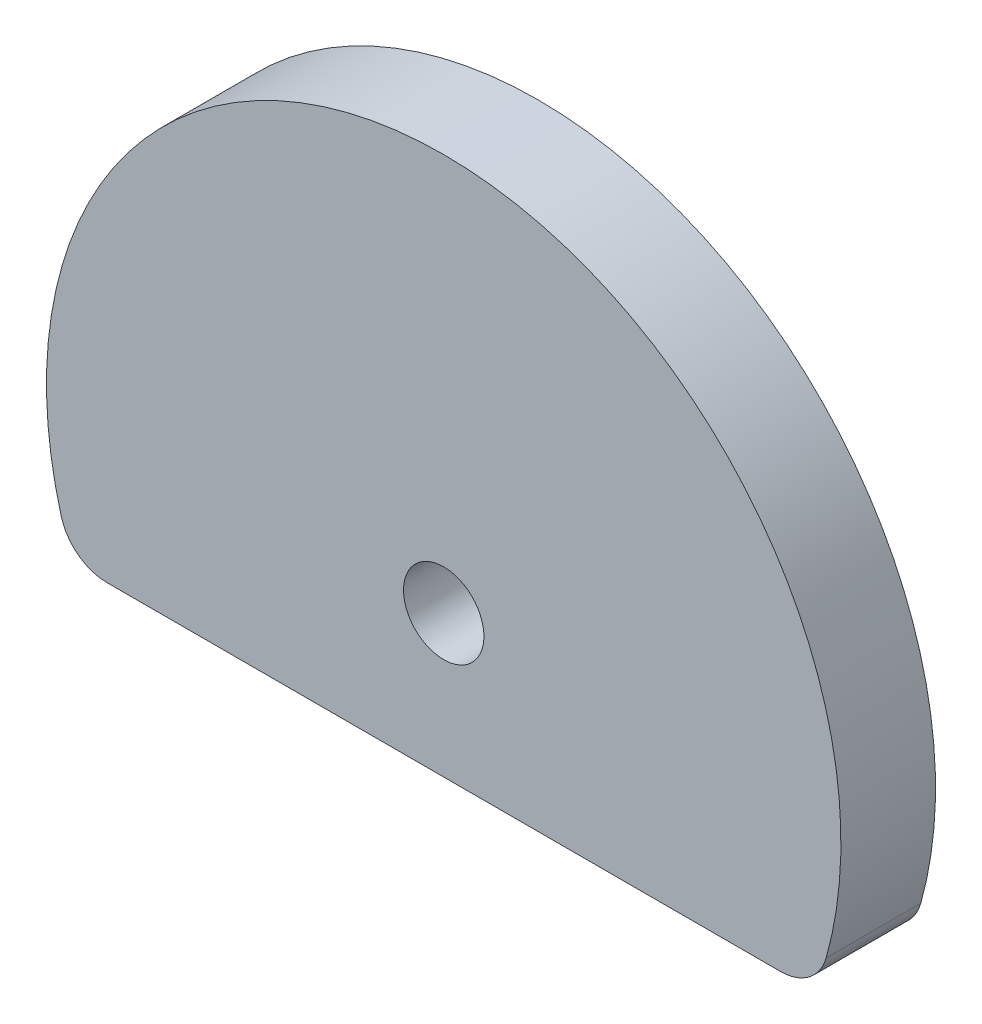
ISO-10303-21;
HEADER;
FILE_DESCRIPTION(('STEP AP214'),'2;1');
FILE_NAME('part.step','',(''),(''),'','','');
FILE_SCHEMA(('AUTOMOTIVE_DESIGN { 1 0 10303 214 1 1 1 1 }'));
ENDSEC;
DATA;
#1=APPLICATION_CONTEXT('core data for automotive mechanical design processes');
#2=APPLICATION_PROTOCOL_DEFINITION('international standard','automotive_design',2000,#1);
#3=PRODUCT_CONTEXT('',#1,'mechanical');
#4=PRODUCT('Part','Part','',(#3));
#5=PRODUCT_RELATED_PRODUCT_CATEGORY('part','',(#4));
#6=PRODUCT_DEFINITION_FORMATION('','',#4);
#7=PRODUCT_DEFINITION_CONTEXT('part definition',#1,'design');
#8=PRODUCT_DEFINITION('design','',#6,#7);
#9=PRODUCT_DEFINITION_SHAPE('','',#8);
#10=(LENGTH_UNIT() NAMED_UNIT(*) SI_UNIT(.MILLI.,.METRE.));
#11=(NAMED_UNIT(*) PLANE_ANGLE_UNIT() SI_UNIT($,.RADIAN.));
#12=(NAMED_UNIT(*) SI_UNIT($,.STERADIAN.) SOLID_ANGLE_UNIT());
#13=UNCERTAINTY_MEASURE_WITH_UNIT(LENGTH_MEASURE(1.E-05),#10,'distance_accuracy_value','');
#14=(GEOMETRIC_REPRESENTATION_CONTEXT(3) GLOBAL_UNCERTAINTY_ASSIGNED_CONTEXT((#13)) GLOBAL_UNIT_ASSIGNED_CONTEXT((#10,
#11,#12)) REPRESENTATION_CONTEXT('',''));
#15=CARTESIAN_POINT('',(0.,0.,0.));
#16=DIRECTION('',(0.,0.,1.));
#17=DIRECTION('',(1.,0.,0.));
#18=AXIS2_PLACEMENT_3D('',#15,#16,#17);
#19=CARTESIAN_POINT('',(0.,0.,0.));
#20=DIRECTION('',(0.,0.,1.));
#21=DIRECTION('',(0.,1.,0.));
#22=AXIS2_PLACEMENT_3D('',#19,#20,#21);
#23=CYLINDRICAL_SURFACE('',#22,8.4);
#24=DIRECTION('',(0.,0.,-1.));
#25=VECTOR('',#24,1.);
#26=CARTESIAN_POINT('',(8.087389745766,-2.27027027027,2.));
#27=LINE('',#26,#25);
#28=CARTESIAN_POINT('',(8.087389745766,-2.27027027027,2.));
#29=VERTEX_POINT('',#28);
#30=CARTESIAN_POINT('',(8.087389745766,-2.27027027027,0.));
#31=VERTEX_POINT('',#30);
#32=EDGE_CURVE('E61',#29,#31,#27,.T.);
#33=ORIENTED_EDGE('',*,*,#32,.T.);
#34=CARTESIAN_POINT('',(0.,0.,0.));
#35=DIRECTION('',(0.,0.,1.));
#36=DIRECTION('',(0.962784493543606,-0.270270270270302,0.));
#37=AXIS2_PLACEMENT_3D('',#34,#35,#36);
#38=CIRCLE('',#37,8.4);
#39=CARTESIAN_POINT('',(-8.087389745766,-2.27027027027,0.));
#40=VERTEX_POINT('',#39);
#41=EDGE_CURVE('E64',#31,#40,#38,.T.);
#42=ORIENTED_EDGE('',*,*,#41,.T.);
#43=DIRECTION('',(0.,0.,-1.));
#44=VECTOR('',#43,1.);
#45=CARTESIAN_POINT('',(-8.087389745766,-2.27027027027,2.));
#46=LINE('',#45,#44);
#47=CARTESIAN_POINT('',(-8.087389745766,-2.27027027027,2.));
#48=VERTEX_POINT('',#47);
#49=EDGE_CURVE('E11',#48,#40,#46,.T.);
#50=ORIENTED_EDGE('',*,*,#49,.F.);
#51=CARTESIAN_POINT('',(0.,0.,2.));
#52=DIRECTION('',(0.,0.,1.));
#53=DIRECTION('',(0.962784493543606,-0.270270270270302,0.));
#54=AXIS2_PLACEMENT_3D('',#51,#52,#53);
#55=CIRCLE('',#54,8.4);
#56=EDGE_CURVE('E67',#29,#48,#55,.T.);
#57=ORIENTED_EDGE('',*,*,#56,.F.);
#58=EDGE_LOOP('',(#33,#42,#50,#57));
#59=FACE_BOUND('',#58,.T.);
#60=ADVANCED_FACE('F17',(#59),#23,.T.);
#61=CARTESIAN_POINT('',(-7.124605252223,-2.,4.6072));
#62=DIRECTION('',(0.,0.,-1.));
#63=DIRECTION('',(0.,-1.,0.));
#64=AXIS2_PLACEMENT_3D('',#61,#62,#63);
#65=CYLINDRICAL_SURFACE('',#64,1.);
#66=CARTESIAN_POINT('',(-7.124605252223,-2.,0.));
#67=DIRECTION('',(0.,0.,-1.));
#68=DIRECTION('',(0.,-1.,0.));
#69=AXIS2_PLACEMENT_3D('',#66,#67,#68);
#70=CIRCLE('',#69,1.);
#71=CARTESIAN_POINT('',(-7.124605252223,-3.,0.));
#72=VERTEX_POINT('',#71);
#73=EDGE_CURVE('E81',#72,#40,#70,.T.);
#74=ORIENTED_EDGE('',*,*,#73,.F.);
#75=DIRECTION('',(0.,0.,-1.));
#76=VECTOR('',#75,1.);
#77=CARTESIAN_POINT('',(-7.124605252223,-3.,2.));
#78=LINE('',#77,#76);
#79=CARTESIAN_POINT('',(-7.124605252223,-3.,2.));
#80=VERTEX_POINT('',#79);
#81=EDGE_CURVE('E28',#80,#72,#78,.T.);
#82=ORIENTED_EDGE('',*,*,#81,.F.);
#83=CARTESIAN_POINT('',(-7.124605252223,-2.,2.));
#84=DIRECTION('',(0.,0.,1.));
#85=DIRECTION('',(-0.962784493543606,-0.270270270270302,0.));
#86=AXIS2_PLACEMENT_3D('',#83,#84,#85);
#87=CIRCLE('',#86,1.);
#88=EDGE_CURVE('E103',#48,#80,#87,.T.);
#89=ORIENTED_EDGE('',*,*,#88,.F.);
#90=ORIENTED_EDGE('',*,*,#49,.T.);
#91=EDGE_LOOP('',(#74,#82,#89,#90));
#92=FACE_BOUND('',#91,.T.);
#93=ADVANCED_FACE('F161',(#92),#65,.T.);
#94=CARTESIAN_POINT('',(-7.846018098373,-3.,0.));
#95=DIRECTION('',(0.,-1.,0.));
#96=DIRECTION('',(0.,0.,-1.));
#97=AXIS2_PLACEMENT_3D('',#94,#95,#96);
#98=PLANE('',#97);
#99=DIRECTION('',(0.,0.,-1.));
#100=VECTOR('',#99,1.);
#101=CARTESIAN_POINT('',(7.124605252223,-3.,2.));
#102=LINE('',#101,#100);
#103=CARTESIAN_POINT('',(7.124605252223,-3.,2.));
#104=VERTEX_POINT('',#103);
#105=CARTESIAN_POINT('',(7.124605252223,-3.,0.));
#106=VERTEX_POINT('',#105);
#107=EDGE_CURVE('E73',#104,#106,#102,.T.);
#108=ORIENTED_EDGE('',*,*,#107,.F.);
#109=DIRECTION('',(1.,0.,0.));
#110=VECTOR('',#109,1.);
#111=CARTESIAN_POINT('',(-7.124605252223,-3.,2.));
#112=LINE('',#111,#110);
#113=EDGE_CURVE('E74',#80,#104,#112,.T.);
#114=ORIENTED_EDGE('',*,*,#113,.F.);
#115=ORIENTED_EDGE('',*,*,#81,.T.);
#116=DIRECTION('',(1.,0.,0.));
#117=VECTOR('',#116,1.);
#118=CARTESIAN_POINT('',(-7.124605252223,-3.,0.));
#119=LINE('',#118,#117);
#120=EDGE_CURVE('E21',#72,#106,#119,.T.);
#121=ORIENTED_EDGE('',*,*,#120,.T.);
#122=EDGE_LOOP('',(#108,#114,#115,#121));
#123=FACE_BOUND('',#122,.T.);
#124=ADVANCED_FACE('F19',(#123),#98,.T.);
#125=CARTESIAN_POINT('',(7.124605252223,-2.,4.6072));
#126=DIRECTION('',(0.,0.,-1.));
#127=DIRECTION('',(0.962784493543606,-0.270270270270302,0.));
#128=AXIS2_PLACEMENT_3D('',#125,#126,#127);
#129=CYLINDRICAL_SURFACE('',#128,1.);
#130=CARTESIAN_POINT('',(7.124605252223,-2.,0.));
#131=DIRECTION('',(0.,0.,-1.));
#132=DIRECTION('',(0.962784493543606,-0.270270270270302,0.));
#133=AXIS2_PLACEMENT_3D('',#130,#131,#132);
#134=CIRCLE('',#133,1.);
#135=EDGE_CURVE('E80',#31,#106,#134,.T.);
#136=ORIENTED_EDGE('',*,*,#135,.F.);
#137=ORIENTED_EDGE('',*,*,#32,.F.);
#138=CARTESIAN_POINT('',(7.124605252223,-2.,2.));
#139=DIRECTION('',(0.,0.,1.));
#140=DIRECTION('',(0.,-1.,0.));
#141=AXIS2_PLACEMENT_3D('',#138,#139,#140);
#142=CIRCLE('',#141,1.);
#143=EDGE_CURVE('E99',#104,#29,#142,.T.);
#144=ORIENTED_EDGE('',*,*,#143,.F.);
#145=ORIENTED_EDGE('',*,*,#107,.T.);
#146=EDGE_LOOP('',(#136,#137,#144,#145));
#147=FACE_BOUND('',#146,.T.);
#148=ADVANCED_FACE('F84',(#147),#129,.T.);
#149=CARTESIAN_POINT('',(0.,0.,2.));
#150=DIRECTION('',(0.,0.,1.));
#151=DIRECTION('',(1.,0.,0.));
#152=AXIS2_PLACEMENT_3D('',#149,#150,#151);
#153=PLANE('',#152);
#154=CARTESIAN_POINT('',(0.,0.,2.));
#155=DIRECTION('',(0.,0.,-1.));
#156=DIRECTION('',(1.,0.,0.));
#157=AXIS2_PLACEMENT_3D('',#154,#155,#156);
#158=CIRCLE('',#157,0.85);
#159=CARTESIAN_POINT('',(-0.85,0.,2.));
#160=VERTEX_POINT('',#159);
#161=EDGE_CURVE('E95',#160,#160,#158,.T.);
#162=ORIENTED_EDGE('',*,*,#161,.T.);
#163=EDGE_LOOP('',(#162));
#164=FACE_BOUND('',#163,.T.);
#165=ORIENTED_EDGE('',*,*,#143,.T.);
#166=ORIENTED_EDGE('',*,*,#56,.T.);
#167=ORIENTED_EDGE('',*,*,#88,.T.);
#168=ORIENTED_EDGE('',*,*,#113,.T.);
#169=EDGE_LOOP('',(#165,#166,#167,#168));
#170=FACE_BOUND('',#169,.T.);
#171=ADVANCED_FACE('F129',(#164,#170),#153,.T.);
#172=CARTESIAN_POINT('',(0.,0.,0.));
#173=DIRECTION('',(0.,0.,1.));
#174=DIRECTION('',(1.,0.,0.));
#175=AXIS2_PLACEMENT_3D('',#172,#173,#174);
#176=CYLINDRICAL_SURFACE('',#175,0.85);
#177=CARTESIAN_POINT('',(0.,0.,0.));
#178=DIRECTION('',(0.,0.,-1.));
#179=DIRECTION('',(1.,0.,0.));
#180=AXIS2_PLACEMENT_3D('',#177,#178,#179);
#181=CIRCLE('',#180,0.85);
#182=CARTESIAN_POINT('',(-0.85,0.,0.));
#183=VERTEX_POINT('',#182);
#184=EDGE_CURVE('E83',#183,#183,#181,.T.);
#185=ORIENTED_EDGE('',*,*,#184,.T.);
#186=DIRECTION('',(0.,0.,1.));
#187=VECTOR('',#186,1.);
#188=CARTESIAN_POINT('',(-0.85,0.,0.));
#189=LINE('',#188,#187);
#190=EDGE_CURVE('E100',#183,#160,#189,.T.);
#191=ORIENTED_EDGE('',*,*,#190,.T.);
#192=ORIENTED_EDGE('',*,*,#161,.F.);
#193=ORIENTED_EDGE('',*,*,#190,.F.);
#194=EDGE_LOOP('',(#185,#191,#192,#193));
#195=FACE_BOUND('',#194,.T.);
#196=ADVANCED_FACE('F148',(#195),#176,.F.);
#197=CARTESIAN_POINT('',(0.,0.,0.));
#198=DIRECTION('',(0.,0.,1.));
#199=DIRECTION('',(1.,0.,0.));
#200=AXIS2_PLACEMENT_3D('',#197,#198,#199);
#201=PLANE('',#200);
#202=ORIENTED_EDGE('',*,*,#184,.F.);
#203=EDGE_LOOP('',(#202));
#204=FACE_BOUND('',#203,.T.);
#205=ORIENTED_EDGE('',*,*,#135,.T.);
#206=ORIENTED_EDGE('',*,*,#120,.F.);
#207=ORIENTED_EDGE('',*,*,#73,.T.);
#208=ORIENTED_EDGE('',*,*,#41,.F.);
#209=EDGE_LOOP('',(#205,#206,#207,#208));
#210=FACE_BOUND('',#209,.T.);
#211=ADVANCED_FACE('F78',(#204,#210),#201,.F.);
#212=CLOSED_SHELL('',(#60,#93,#124,#148,#171,#196,#211));
#213=MANIFOLD_SOLID_BREP('B1',#212);
#214=ADVANCED_BREP_SHAPE_REPRESENTATION('',(#18,#213),#14);
#215=SHAPE_DEFINITION_REPRESENTATION(#9,#214);
ENDSEC;
END-ISO-10303-21;
